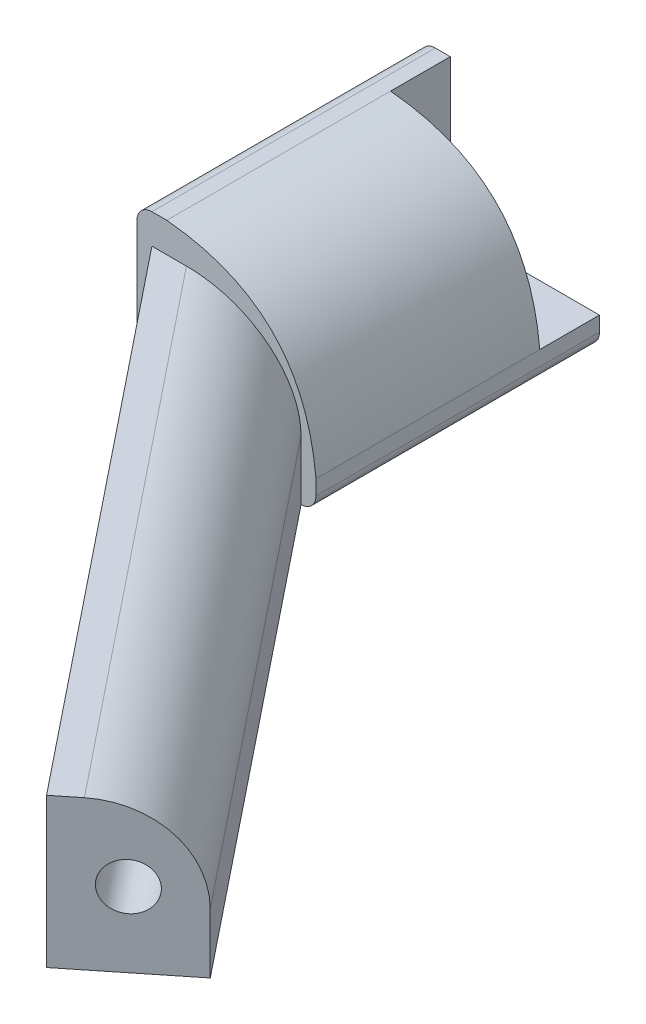
ISO-10303-21;
HEADER;
FILE_DESCRIPTION(('STEP AP214'),'2;1');
FILE_NAME('part.step','',(''),(''),'','','');
FILE_SCHEMA(('AUTOMOTIVE_DESIGN { 1 0 10303 214 1 1 1 1 }'));
ENDSEC;
DATA;
#1=APPLICATION_CONTEXT('core data for automotive mechanical design processes');
#2=APPLICATION_PROTOCOL_DEFINITION('international standard','automotive_design',2000,#1);
#3=PRODUCT_CONTEXT('',#1,'mechanical');
#4=PRODUCT('Part','Part','',(#3));
#5=PRODUCT_RELATED_PRODUCT_CATEGORY('part','',(#4));
#6=PRODUCT_DEFINITION_FORMATION('','',#4);
#7=PRODUCT_DEFINITION_CONTEXT('part definition',#1,'design');
#8=PRODUCT_DEFINITION('design','',#6,#7);
#9=PRODUCT_DEFINITION_SHAPE('','',#8);
#10=(LENGTH_UNIT() NAMED_UNIT(*) SI_UNIT(.MILLI.,.METRE.));
#11=(NAMED_UNIT(*) PLANE_ANGLE_UNIT() SI_UNIT($,.RADIAN.));
#12=(NAMED_UNIT(*) SI_UNIT($,.STERADIAN.) SOLID_ANGLE_UNIT());
#13=UNCERTAINTY_MEASURE_WITH_UNIT(LENGTH_MEASURE(1.E-05),#10,'distance_accuracy_value','');
#14=(GEOMETRIC_REPRESENTATION_CONTEXT(3) GLOBAL_UNCERTAINTY_ASSIGNED_CONTEXT((#13)) GLOBAL_UNIT_ASSIGNED_CONTEXT((#10,
#11,#12)) REPRESENTATION_CONTEXT('',''));
#15=CARTESIAN_POINT('',(0.,0.,0.));
#16=DIRECTION('',(0.,0.,1.));
#17=DIRECTION('',(1.,0.,0.));
#18=AXIS2_PLACEMENT_3D('',#15,#16,#17);
#19=CARTESIAN_POINT('',(8.98515136267974,8.98515136267974,6.35));
#20=DIRECTION('',(0.,0.,1.));
#21=DIRECTION('',(1.,0.,0.));
#22=AXIS2_PLACEMENT_3D('',#19,#20,#21);
#23=PLANE('',#22);
#24=CARTESIAN_POINT('',(5.08,5.08,6.35));
#25=DIRECTION('',(0.,0.,1.));
#26=DIRECTION('',(1.,0.,0.));
#27=AXIS2_PLACEMENT_3D('',#24,#25,#26);
#28=CIRCLE('',#27,1.2);
#29=CARTESIAN_POINT('',(6.28,5.08,6.35));
#30=VERTEX_POINT('',#29);
#31=EDGE_CURVE('E196',#30,#30,#28,.T.);
#32=ORIENTED_EDGE('',*,*,#31,.F.);
#33=EDGE_LOOP('',(#32));
#34=FACE_BOUND('',#33,.T.);
#35=CARTESIAN_POINT('',(5.08,5.08,6.35));
#36=DIRECTION('',(0.,0.,1.));
#37=DIRECTION('',(1.,0.,0.));
#38=AXIS2_PLACEMENT_3D('',#35,#36,#37);
#39=CIRCLE('',#38,3.175);
#40=CARTESIAN_POINT('',(8.255,5.08,6.35));
#41=VERTEX_POINT('',#40);
#42=EDGE_CURVE('E165',#41,#41,#39,.T.);
#43=ORIENTED_EDGE('',*,*,#42,.T.);
#44=EDGE_LOOP('',(#43));
#45=FACE_BOUND('',#44,.T.);
#46=ADVANCED_FACE('F39',(#34,#45),#23,.T.);
#47=CARTESIAN_POINT('',(8.98515136267031,8.98515136267032,0.));
#48=DIRECTION('',(0.,0.,1.));
#49=DIRECTION('',(1.,0.,0.));
#50=AXIS2_PLACEMENT_3D('',#47,#48,#49);
#51=PLANE('',#50);
#52=DIRECTION('',(0.,-1.,0.));
#53=VECTOR('',#52,1.);
#54=CARTESIAN_POINT('',(0.,0.,0.));
#55=LINE('',#54,#53);
#56=CARTESIAN_POINT('',(0.,12.7,0.));
#57=VERTEX_POINT('',#56);
#58=CARTESIAN_POINT('',(0.,0.,0.));
#59=VERTEX_POINT('',#58);
#60=EDGE_CURVE('E259',#57,#59,#55,.T.);
#61=ORIENTED_EDGE('',*,*,#60,.F.);
#62=CARTESIAN_POINT('',(12.7,0.,0.));
#63=CARTESIAN_POINT('',(11.6203027253406,11.6203027253406,0.));
#64=CARTESIAN_POINT('',(0.,12.7,0.));
#65=B_SPLINE_CURVE_WITH_KNOTS('',2,(#62,#63,#64),.UNSPECIFIED.,.F.,.F.,(3,3),(0.,1.),.UNSPECIFIED.);
#66=CARTESIAN_POINT('',(12.7,0.,0.));
#67=VERTEX_POINT('',#66);
#68=EDGE_CURVE('E411',#67,#57,#65,.T.);
#69=ORIENTED_EDGE('',*,*,#68,.F.);
#70=DIRECTION('',(1.,0.,0.));
#71=VECTOR('',#70,1.);
#72=CARTESIAN_POINT('',(0.,0.,0.));
#73=LINE('',#72,#71);
#74=EDGE_CURVE('E263',#59,#67,#73,.T.);
#75=ORIENTED_EDGE('',*,*,#74,.F.);
#76=EDGE_LOOP('',(#61,#69,#75));
#77=FACE_BOUND('',#76,.T.);
#78=CARTESIAN_POINT('',(5.08,5.08,0.));
#79=DIRECTION('',(0.,0.,1.));
#80=DIRECTION('',(1.,0.,0.));
#81=AXIS2_PLACEMENT_3D('',#78,#79,#80);
#82=CIRCLE('',#81,3.1115);
#83=CARTESIAN_POINT('',(1.9685,5.08,0.));
#84=VERTEX_POINT('',#83);
#85=EDGE_CURVE('E254',#84,#84,#82,.T.);
#86=ORIENTED_EDGE('',*,*,#85,.T.);
#87=EDGE_LOOP('',(#86));
#88=FACE_BOUND('',#87,.T.);
#89=ADVANCED_FACE('F277',(#77,#88),#51,.F.);
#90=CARTESIAN_POINT('',(12.7,0.,3.81));
#91=CARTESIAN_POINT('',(11.6203027253406,11.6203027253406,3.81));
#92=CARTESIAN_POINT('',(0.,12.7,3.81));
#93=B_SPLINE_CURVE_WITH_KNOTS('',2,(#90,#91,#92),.UNSPECIFIED.,.F.,.F.,(3,3),(0.,1.),.UNSPECIFIED.);
#94=DIRECTION('',(0.,0.,-1.));
#95=VECTOR('',#94,1.);
#96=SURFACE_OF_LINEAR_EXTRUSION('',#93,#95);
#97=ORIENTED_EDGE('',*,*,#68,.T.);
#98=DIRECTION('',(0.,0.,-1.));
#99=VECTOR('',#98,1.);
#100=CARTESIAN_POINT('',(0.,12.7,3.81));
#101=LINE('',#100,#99);
#102=CARTESIAN_POINT('',(0.,12.7,19.05));
#103=VERTEX_POINT('',#102);
#104=EDGE_CURVE('E408',#103,#57,#101,.T.);
#105=ORIENTED_EDGE('',*,*,#104,.F.);
#106=CARTESIAN_POINT('',(12.7,0.,19.05));
#107=CARTESIAN_POINT('',(11.6203027253595,11.6203027253595,19.05));
#108=CARTESIAN_POINT('',(0.,12.7,19.05));
#109=B_SPLINE_CURVE_WITH_KNOTS('',2,(#106,#107,#108),.UNSPECIFIED.,.F.,.F.,(3,3),(0.,1.),.UNSPECIFIED.);
#110=CARTESIAN_POINT('',(12.7,0.,19.05));
#111=VERTEX_POINT('',#110);
#112=EDGE_CURVE('E173',#111,#103,#109,.T.);
#113=ORIENTED_EDGE('',*,*,#112,.F.);
#114=DIRECTION('',(0.,0.,-1.));
#115=VECTOR('',#114,1.);
#116=CARTESIAN_POINT('',(12.7,0.,3.81));
#117=LINE('',#116,#115);
#118=EDGE_CURVE('E392',#111,#67,#117,.T.);
#119=ORIENTED_EDGE('',*,*,#118,.T.);
#120=EDGE_LOOP('',(#97,#105,#113,#119));
#121=FACE_BOUND('',#120,.T.);
#122=ADVANCED_FACE('F273',(#121),#96,.F.);
#123=CARTESIAN_POINT('',(5.08,5.08,3.81));
#124=DIRECTION('',(0.,0.,-1.));
#125=DIRECTION('',(-1.,0.,0.));
#126=AXIS2_PLACEMENT_3D('',#123,#124,#125);
#127=CYLINDRICAL_SURFACE('',#126,3.1115);
#128=CARTESIAN_POINT('',(5.08,5.08,3.81));
#129=DIRECTION('',(0.,0.,1.));
#130=DIRECTION('',(1.,0.,0.));
#131=AXIS2_PLACEMENT_3D('',#128,#129,#130);
#132=CIRCLE('',#131,3.1115);
#133=CARTESIAN_POINT('',(1.9685,5.08,3.81));
#134=VERTEX_POINT('',#133);
#135=EDGE_CURVE('E199',#134,#134,#132,.T.);
#136=CARTESIAN_POINT('',(1.9685,5.08,3.81));
#137=CARTESIAN_POINT('',(1.9685,5.08,3.7703125));
#138=CARTESIAN_POINT('',(1.9685,5.08,3.730625));
#139=CARTESIAN_POINT('',(1.9685,5.08,3.65125));
#140=CARTESIAN_POINT('',(1.9685,5.08,3.6115625));
#141=CARTESIAN_POINT('',(1.9685,5.08,3.5321875));
#142=CARTESIAN_POINT('',(1.9685,5.08,3.4925));
#143=CARTESIAN_POINT('',(1.9685,5.08,3.413125));
#144=CARTESIAN_POINT('',(1.9685,5.08,3.3734375));
#145=CARTESIAN_POINT('',(1.9685,5.08,3.2940625));
#146=CARTESIAN_POINT('',(1.9685,5.08,3.254375));
#147=CARTESIAN_POINT('',(1.9685,5.08,3.175));
#148=CARTESIAN_POINT('',(1.9685,5.08,3.1353125));
#149=CARTESIAN_POINT('',(1.9685,5.08,3.0559375));
#150=CARTESIAN_POINT('',(1.9685,5.08,3.01625));
#151=CARTESIAN_POINT('',(1.9685,5.08,2.936875));
#152=CARTESIAN_POINT('',(1.9685,5.08,2.8971875));
#153=CARTESIAN_POINT('',(1.9685,5.08,2.8178125));
#154=CARTESIAN_POINT('',(1.9685,5.08,2.778125));
#155=CARTESIAN_POINT('',(1.9685,5.08,2.69875));
#156=CARTESIAN_POINT('',(1.9685,5.08,2.6590625));
#157=CARTESIAN_POINT('',(1.9685,5.08,2.5796875));
#158=CARTESIAN_POINT('',(1.9685,5.08,2.54));
#159=CARTESIAN_POINT('',(1.9685,5.08,2.460625));
#160=CARTESIAN_POINT('',(1.9685,5.08,2.4209375));
#161=CARTESIAN_POINT('',(1.9685,5.08,2.3415625));
#162=CARTESIAN_POINT('',(1.9685,5.08,2.301875));
#163=CARTESIAN_POINT('',(1.9685,5.08,2.2225));
#164=CARTESIAN_POINT('',(1.9685,5.08,2.1828125));
#165=CARTESIAN_POINT('',(1.9685,5.08,2.1034375));
#166=CARTESIAN_POINT('',(1.9685,5.08,2.06375));
#167=CARTESIAN_POINT('',(1.9685,5.08,1.984375));
#168=CARTESIAN_POINT('',(1.9685,5.08,1.9446875));
#169=CARTESIAN_POINT('',(1.9685,5.08,1.8653125));
#170=CARTESIAN_POINT('',(1.9685,5.08,1.825625));
#171=CARTESIAN_POINT('',(1.9685,5.08,1.74625));
#172=CARTESIAN_POINT('',(1.9685,5.08,1.7065625));
#173=CARTESIAN_POINT('',(1.9685,5.08,1.6271875));
#174=CARTESIAN_POINT('',(1.9685,5.08,1.5875));
#175=CARTESIAN_POINT('',(1.9685,5.08,1.508125));
#176=CARTESIAN_POINT('',(1.9685,5.08,1.4684375));
#177=CARTESIAN_POINT('',(1.9685,5.08,1.3890625));
#178=CARTESIAN_POINT('',(1.9685,5.08,1.349375));
#179=CARTESIAN_POINT('',(1.9685,5.08,1.27));
#180=CARTESIAN_POINT('',(1.9685,5.08,1.2303125));
#181=CARTESIAN_POINT('',(1.9685,5.08,1.1509375));
#182=CARTESIAN_POINT('',(1.9685,5.08,1.11125));
#183=CARTESIAN_POINT('',(1.9685,5.08,1.031875));
#184=CARTESIAN_POINT('',(1.9685,5.08,0.9921875));
#185=CARTESIAN_POINT('',(1.9685,5.08,0.9128125));
#186=CARTESIAN_POINT('',(1.9685,5.08,0.873125));
#187=CARTESIAN_POINT('',(1.9685,5.08,0.79375));
#188=CARTESIAN_POINT('',(1.9685,5.08,0.7540625));
#189=CARTESIAN_POINT('',(1.9685,5.08,0.6746875));
#190=CARTESIAN_POINT('',(1.9685,5.08,0.635));
#191=CARTESIAN_POINT('',(1.9685,5.08,0.555625));
#192=CARTESIAN_POINT('',(1.9685,5.08,0.5159375));
#193=CARTESIAN_POINT('',(1.9685,5.08,0.4365625));
#194=CARTESIAN_POINT('',(1.9685,5.08,0.396875));
#195=CARTESIAN_POINT('',(1.9685,5.08,0.3175));
#196=CARTESIAN_POINT('',(1.9685,5.08,0.2778125));
#197=CARTESIAN_POINT('',(1.9685,5.08,0.1984375));
#198=CARTESIAN_POINT('',(1.9685,5.08,0.15875));
#199=CARTESIAN_POINT('',(1.9685,5.08,0.0793749999999999));
#200=CARTESIAN_POINT('',(1.9685,5.08,0.0396874999999999));
#201=CARTESIAN_POINT('',(1.9685,5.08,0.));
#202=B_SPLINE_CURVE_WITH_KNOTS('',3,(#136,#137,#138,#139,#140,#141,#142,#143,#144,#145,#146,
#147,#148,#149,#150,#151,#152,#153,#154,#155,#156,#157,#158,#159,#160,#161,#162,#163,#164,#165,
#166,#167,#168,#169,#170,#171,#172,#173,#174,#175,#176,#177,#178,#179,#180,#181,#182,#183,#184,
#185,#186,#187,#188,#189,#190,#191,#192,#193,#194,#195,#196,#197,#198,#199,#200,#201),
.UNSPECIFIED.,.F.,.F.,(4,2,2,2,2,2,2,2,2,2,2,2,2,2,2,2,2,2,2,2,2,2,2,2,2,2,2,2,2,2,2,2,4),(0.,
0.1190625,0.238125,0.3571875,0.47625,0.5953125,0.714375,0.8334375,0.9525,1.0715625,1.190625,
1.3096875,1.42875,1.5478125,1.666875,1.7859375,1.905,2.0240625,2.143125,2.2621875,2.38125,
2.5003125,2.619375,2.7384375,2.8575,2.9765625,3.095625,3.2146875,3.33375,3.4528125,3.571875,
3.6909375,3.81),.UNSPECIFIED.);
#203=EDGE_CURVE('BSEAM276',#134,#84,#202,.T.);
#204=ORIENTED_EDGE('',*,*,#135,.T.);
#205=ORIENTED_EDGE('',*,*,#85,.F.);
#206=ORIENTED_EDGE('',*,*,#203,.T.);
#207=ORIENTED_EDGE('',*,*,#203,.F.);
#208=EDGE_LOOP('',(#204,#206,#205,#207));
#209=FACE_BOUND('',#208,.T.);
#210=ADVANCED_FACE('F276',(#209),#127,.F.);
#211=CARTESIAN_POINT('',(0.,0.,3.81));
#212=DIRECTION('',(0.,1.,0.));
#213=DIRECTION('',(0.,0.,1.));
#214=AXIS2_PLACEMENT_3D('',#211,#212,#213);
#215=PLANE('',#214);
#216=ORIENTED_EDGE('',*,*,#74,.T.);
#217=DIRECTION('',(0.,0.,-1.));
#218=VECTOR('',#217,1.);
#219=CARTESIAN_POINT('',(12.7,0.,3.81));
#220=LINE('',#219,#218);
#221=CARTESIAN_POINT('',(12.7,0.,-5.08));
#222=VERTEX_POINT('',#221);
#223=EDGE_CURVE('E241',#67,#222,#220,.T.);
#224=ORIENTED_EDGE('',*,*,#223,.T.);
#225=DIRECTION('',(1.,0.,0.));
#226=VECTOR('',#225,1.);
#227=CARTESIAN_POINT('',(0.,0.,-5.08));
#228=LINE('',#227,#226);
#229=CARTESIAN_POINT('',(0.,0.,-5.08));
#230=VERTEX_POINT('',#229);
#231=EDGE_CURVE('E220',#230,#222,#228,.T.);
#232=ORIENTED_EDGE('',*,*,#231,.F.);
#233=DIRECTION('',(0.,0.,-1.));
#234=VECTOR('',#233,1.);
#235=CARTESIAN_POINT('',(0.,0.,3.81));
#236=LINE('',#235,#234);
#237=EDGE_CURVE('E234',#59,#230,#236,.T.);
#238=ORIENTED_EDGE('',*,*,#237,.F.);
#239=EDGE_LOOP('',(#216,#224,#232,#238));
#240=FACE_BOUND('',#239,.T.);
#241=ADVANCED_FACE('F284',(#240),#215,.T.);
#242=CARTESIAN_POINT('',(0.,12.7,3.81));
#243=DIRECTION('',(1.,0.,0.));
#244=DIRECTION('',(0.,0.,-1.));
#245=AXIS2_PLACEMENT_3D('',#242,#243,#244);
#246=PLANE('',#245);
#247=ORIENTED_EDGE('',*,*,#60,.T.);
#248=ORIENTED_EDGE('',*,*,#237,.T.);
#249=DIRECTION('',(0.,-1.,0.));
#250=VECTOR('',#249,1.);
#251=CARTESIAN_POINT('',(0.,12.7,-5.08));
#252=LINE('',#251,#250);
#253=CARTESIAN_POINT('',(0.,12.7,-5.08));
#254=VERTEX_POINT('',#253);
#255=EDGE_CURVE('E223',#254,#230,#252,.T.);
#256=ORIENTED_EDGE('',*,*,#255,.F.);
#257=DIRECTION('',(0.,0.,-1.));
#258=VECTOR('',#257,1.);
#259=CARTESIAN_POINT('',(0.,12.7,3.81));
#260=LINE('',#259,#258);
#261=EDGE_CURVE('E231',#57,#254,#260,.T.);
#262=ORIENTED_EDGE('',*,*,#261,.F.);
#263=EDGE_LOOP('',(#247,#248,#256,#262));
#264=FACE_BOUND('',#263,.T.);
#265=ADVANCED_FACE('F290',(#264),#246,.T.);
#266=CARTESIAN_POINT('',(-1.27,11.43,3.81));
#267=DIRECTION('',(0.,0.,-1.));
#268=DIRECTION('',(-1.,0.,0.));
#269=AXIS2_PLACEMENT_3D('',#266,#267,#268);
#270=CYLINDRICAL_SURFACE('',#269,1.27);
#271=DIRECTION('',(0.,0.,-1.));
#272=VECTOR('',#271,1.);
#273=CARTESIAN_POINT('',(-1.26999999999999,12.7,3.81));
#274=LINE('',#273,#272);
#275=CARTESIAN_POINT('',(-1.27,12.7,19.05));
#276=VERTEX_POINT('',#275);
#277=CARTESIAN_POINT('',(-1.26999999999999,12.7,-5.08));
#278=VERTEX_POINT('',#277);
#279=EDGE_CURVE('E229',#276,#278,#274,.T.);
#280=ORIENTED_EDGE('',*,*,#279,.T.);
#281=CARTESIAN_POINT('',(-1.27,11.43,-5.08));
#282=DIRECTION('',(0.,0.,1.));
#283=DIRECTION('',(1.,0.,0.));
#284=AXIS2_PLACEMENT_3D('',#281,#282,#283);
#285=CIRCLE('',#284,1.27);
#286=CARTESIAN_POINT('',(-2.54,11.43,-5.08));
#287=VERTEX_POINT('',#286);
#288=EDGE_CURVE('E202',#278,#287,#285,.T.);
#289=ORIENTED_EDGE('',*,*,#288,.T.);
#290=DIRECTION('',(0.,0.,-1.));
#291=VECTOR('',#290,1.);
#292=CARTESIAN_POINT('',(-2.54,11.43,3.81));
#293=LINE('',#292,#291);
#294=CARTESIAN_POINT('',(-2.54,11.43,19.05));
#295=VERTEX_POINT('',#294);
#296=EDGE_CURVE('E239',#295,#287,#293,.T.);
#297=ORIENTED_EDGE('',*,*,#296,.F.);
#298=CARTESIAN_POINT('',(-1.27,11.43,19.05));
#299=DIRECTION('',(0.,0.,1.));
#300=DIRECTION('',(-1.,0.,0.));
#301=AXIS2_PLACEMENT_3D('',#298,#299,#300);
#302=CIRCLE('',#301,1.27);
#303=EDGE_CURVE('E183',#276,#295,#302,.T.);
#304=ORIENTED_EDGE('',*,*,#303,.F.);
#305=EDGE_LOOP('',(#280,#289,#297,#304));
#306=FACE_BOUND('',#305,.T.);
#307=ADVANCED_FACE('F286',(#306),#270,.T.);
#308=CARTESIAN_POINT('',(-2.54,11.43,3.81));
#309=DIRECTION('',(1.,0.,0.));
#310=DIRECTION('',(0.,1.,0.));
#311=AXIS2_PLACEMENT_3D('',#308,#309,#310);
#312=PLANE('',#311);
#313=ORIENTED_EDGE('',*,*,#296,.T.);
#314=DIRECTION('',(0.,-1.,0.));
#315=VECTOR('',#314,1.);
#316=CARTESIAN_POINT('',(-2.54,11.43,-5.08));
#317=LINE('',#316,#315);
#318=CARTESIAN_POINT('',(-2.54,-1.26999999999999,-5.08));
#319=VERTEX_POINT('',#318);
#320=EDGE_CURVE('E205',#287,#319,#317,.T.);
#321=ORIENTED_EDGE('',*,*,#320,.T.);
#322=DIRECTION('',(0.,0.,-1.));
#323=VECTOR('',#322,1.);
#324=CARTESIAN_POINT('',(-2.54,-1.26999999999999,3.81));
#325=LINE('',#324,#323);
#326=CARTESIAN_POINT('',(-2.54,-1.26999999999999,19.05));
#327=VERTEX_POINT('',#326);
#328=EDGE_CURVE('E251',#327,#319,#325,.T.);
#329=ORIENTED_EDGE('',*,*,#328,.F.);
#330=DIRECTION('',(0.,-1.,0.));
#331=VECTOR('',#330,1.);
#332=CARTESIAN_POINT('',(-2.54,11.43,19.05));
#333=LINE('',#332,#331);
#334=EDGE_CURVE('E186',#295,#327,#333,.T.);
#335=ORIENTED_EDGE('',*,*,#334,.F.);
#336=EDGE_LOOP('',(#313,#321,#329,#335));
#337=FACE_BOUND('',#336,.T.);
#338=ADVANCED_FACE('F289',(#337),#312,.F.);
#339=CARTESIAN_POINT('',(-1.27,-1.27,3.81));
#340=DIRECTION('',(0.,0.,-1.));
#341=DIRECTION('',(-1.,0.,0.));
#342=AXIS2_PLACEMENT_3D('',#339,#340,#341);
#343=CYLINDRICAL_SURFACE('',#342,1.27);
#344=ORIENTED_EDGE('',*,*,#328,.T.);
#345=CARTESIAN_POINT('',(-1.27,-1.27,-5.08));
#346=DIRECTION('',(0.,0.,-1.));
#347=DIRECTION('',(-1.,0.,0.));
#348=AXIS2_PLACEMENT_3D('',#345,#346,#347);
#349=CIRCLE('',#348,1.27);
#350=CARTESIAN_POINT('',(-1.26999999999999,-2.54,-5.08));
#351=VERTEX_POINT('',#350);
#352=EDGE_CURVE('E208',#351,#319,#349,.T.);
#353=ORIENTED_EDGE('',*,*,#352,.F.);
#354=DIRECTION('',(0.,0.,-1.));
#355=VECTOR('',#354,1.);
#356=CARTESIAN_POINT('',(-1.26999999999999,-2.54,3.81));
#357=LINE('',#356,#355);
#358=CARTESIAN_POINT('',(-1.26999999999999,-2.54,19.05));
#359=VERTEX_POINT('',#358);
#360=EDGE_CURVE('E250',#359,#351,#357,.T.);
#361=ORIENTED_EDGE('',*,*,#360,.F.);
#362=CARTESIAN_POINT('',(-1.27,-1.27,19.05));
#363=DIRECTION('',(0.,0.,1.));
#364=DIRECTION('',(1.,0.,0.));
#365=AXIS2_PLACEMENT_3D('',#362,#363,#364);
#366=CIRCLE('',#365,1.27);
#367=EDGE_CURVE('E161',#327,#359,#366,.T.);
#368=ORIENTED_EDGE('',*,*,#367,.F.);
#369=EDGE_LOOP('',(#344,#353,#361,#368));
#370=FACE_BOUND('',#369,.T.);
#371=ADVANCED_FACE('F294',(#370),#343,.T.);
#372=CARTESIAN_POINT('',(11.43,-2.54,3.81));
#373=DIRECTION('',(0.,-1.,0.));
#374=DIRECTION('',(0.,0.,-1.));
#375=AXIS2_PLACEMENT_3D('',#372,#373,#374);
#376=PLANE('',#375);
#377=ORIENTED_EDGE('',*,*,#360,.T.);
#378=DIRECTION('',(-1.,0.,0.));
#379=VECTOR('',#378,1.);
#380=CARTESIAN_POINT('',(11.43,-2.54,-5.08));
#381=LINE('',#380,#379);
#382=CARTESIAN_POINT('',(11.43,-2.54,-5.08));
#383=VERTEX_POINT('',#382);
#384=EDGE_CURVE('E211',#383,#351,#381,.T.);
#385=ORIENTED_EDGE('',*,*,#384,.F.);
#386=DIRECTION('',(0.,0.,-1.));
#387=VECTOR('',#386,1.);
#388=CARTESIAN_POINT('',(11.43,-2.54,3.81));
#389=LINE('',#388,#387);
#390=CARTESIAN_POINT('',(11.43,-2.54,19.05));
#391=VERTEX_POINT('',#390);
#392=EDGE_CURVE('E248',#391,#383,#389,.T.);
#393=ORIENTED_EDGE('',*,*,#392,.F.);
#394=DIRECTION('',(0.624970196645458,0.,0.780648610646902));
#395=VECTOR('',#394,1.);
#396=CARTESIAN_POINT('',(11.43,-2.54,19.05));
#397=LINE('',#396,#395);
#398=CARTESIAN_POINT('',(42.4640691225712,-2.54,57.8145732121188));
#399=VERTEX_POINT('',#398);
#400=EDGE_CURVE('E155',#391,#399,#397,.T.);
#401=ORIENTED_EDGE('',*,*,#400,.T.);
#402=DIRECTION('',(-0.780648610646902,0.,0.624970196645457));
#403=VECTOR('',#402,1.);
#404=CARTESIAN_POINT('',(42.4640691225712,-2.54,57.8145732121188));
#405=LINE('',#404,#403);
#406=CARTESIAN_POINT('',(34.7245335055985,-2.54,64.0106760815977));
#407=VERTEX_POINT('',#406);
#408=EDGE_CURVE('E387',#399,#407,#405,.T.);
#409=ORIENTED_EDGE('',*,*,#408,.T.);
#410=DIRECTION('',(0.624970196645458,0.,0.780648610646902));
#411=VECTOR('',#410,1.);
#412=CARTESIAN_POINT('',(-1.26999999999999,-2.54,19.05));
#413=LINE('',#412,#411);
#414=EDGE_CURVE('E385',#359,#407,#413,.T.);
#415=ORIENTED_EDGE('',*,*,#414,.F.);
#416=EDGE_LOOP('',(#377,#385,#393,#401,#409,#415));
#417=FACE_BOUND('',#416,.T.);
#418=ADVANCED_FACE('F297',(#417),#376,.T.);
#419=CARTESIAN_POINT('',(11.43,-1.27,3.81));
#420=DIRECTION('',(0.,0.,-1.));
#421=DIRECTION('',(-1.,0.,0.));
#422=AXIS2_PLACEMENT_3D('',#419,#420,#421);
#423=CYLINDRICAL_SURFACE('',#422,1.27);
#424=ORIENTED_EDGE('',*,*,#392,.T.);
#425=CARTESIAN_POINT('',(11.43,-1.27,-5.08));
#426=DIRECTION('',(0.,0.,-1.));
#427=DIRECTION('',(-1.,0.,0.));
#428=AXIS2_PLACEMENT_3D('',#425,#426,#427);
#429=CIRCLE('',#428,1.27);
#430=CARTESIAN_POINT('',(12.7,-1.26999999999999,-5.08));
#431=VERTEX_POINT('',#430);
#432=EDGE_CURVE('E214',#431,#383,#429,.T.);
#433=ORIENTED_EDGE('',*,*,#432,.F.);
#434=DIRECTION('',(0.,0.,-1.));
#435=VECTOR('',#434,1.);
#436=CARTESIAN_POINT('',(12.7,-1.26999999999999,3.81));
#437=LINE('',#436,#435);
#438=CARTESIAN_POINT('',(12.7,-1.27,19.05));
#439=VERTEX_POINT('',#438);
#440=EDGE_CURVE('E243',#439,#431,#437,.T.);
#441=ORIENTED_EDGE('',*,*,#440,.F.);
#442=CARTESIAN_POINT('',(11.43,-1.27,19.05));
#443=DIRECTION('',(0.,0.,1.));
#444=DIRECTION('',(1.,0.,0.));
#445=AXIS2_PLACEMENT_3D('',#442,#443,#444);
#446=CIRCLE('',#445,1.27);
#447=EDGE_CURVE('E189',#391,#439,#446,.T.);
#448=ORIENTED_EDGE('',*,*,#447,.F.);
#449=EDGE_LOOP('',(#424,#433,#441,#448));
#450=FACE_BOUND('',#449,.T.);
#451=ADVANCED_FACE('F300',(#450),#423,.T.);
#452=CARTESIAN_POINT('',(12.7,0.,3.81));
#453=DIRECTION('',(1.,0.,0.));
#454=DIRECTION('',(0.,0.,-1.));
#455=AXIS2_PLACEMENT_3D('',#452,#453,#454);
#456=PLANE('',#455);
#457=ORIENTED_EDGE('',*,*,#440,.T.);
#458=DIRECTION('',(0.,-1.,0.));
#459=VECTOR('',#458,1.);
#460=CARTESIAN_POINT('',(12.7,0.,-5.08));
#461=LINE('',#460,#459);
#462=EDGE_CURVE('E217',#222,#431,#461,.T.);
#463=ORIENTED_EDGE('',*,*,#462,.F.);
#464=ORIENTED_EDGE('',*,*,#223,.F.);
#465=ORIENTED_EDGE('',*,*,#118,.F.);
#466=DIRECTION('',(0.,1.,0.));
#467=VECTOR('',#466,1.);
#468=CARTESIAN_POINT('',(12.7,-1.27,19.05));
#469=LINE('',#468,#467);
#470=EDGE_CURVE('E192',#439,#111,#469,.T.);
#471=ORIENTED_EDGE('',*,*,#470,.F.);
#472=EDGE_LOOP('',(#457,#463,#464,#465,#471));
#473=FACE_BOUND('',#472,.T.);
#474=ADVANCED_FACE('F304',(#473),#456,.T.);
#475=CARTESIAN_POINT('',(0.,12.7,3.81));
#476=DIRECTION('',(0.,-1.,0.));
#477=DIRECTION('',(0.,0.,-1.));
#478=AXIS2_PLACEMENT_3D('',#475,#476,#477);
#479=PLANE('',#478);
#480=ORIENTED_EDGE('',*,*,#104,.T.);
#481=ORIENTED_EDGE('',*,*,#261,.T.);
#482=DIRECTION('',(-1.,0.,0.));
#483=VECTOR('',#482,1.);
#484=CARTESIAN_POINT('',(0.,12.7,-5.08));
#485=LINE('',#484,#483);
#486=EDGE_CURVE('E226',#254,#278,#485,.T.);
#487=ORIENTED_EDGE('',*,*,#486,.T.);
#488=ORIENTED_EDGE('',*,*,#279,.F.);
#489=DIRECTION('',(-1.,0.,0.));
#490=VECTOR('',#489,1.);
#491=CARTESIAN_POINT('',(-1.27,12.7,19.05));
#492=LINE('',#491,#490);
#493=EDGE_CURVE('E177',#103,#276,#492,.T.);
#494=ORIENTED_EDGE('',*,*,#493,.F.);
#495=EDGE_LOOP('',(#480,#481,#487,#488,#494));
#496=FACE_BOUND('',#495,.T.);
#497=ADVANCED_FACE('F308',(#496),#479,.F.);
#498=CARTESIAN_POINT('',(-1.27,11.43,-5.08));
#499=DIRECTION('',(0.,0.,1.));
#500=DIRECTION('',(1.,0.,0.));
#501=AXIS2_PLACEMENT_3D('',#498,#499,#500);
#502=PLANE('',#501);
#503=ORIENTED_EDGE('',*,*,#288,.F.);
#504=ORIENTED_EDGE('',*,*,#486,.F.);
#505=ORIENTED_EDGE('',*,*,#255,.T.);
#506=ORIENTED_EDGE('',*,*,#231,.T.);
#507=ORIENTED_EDGE('',*,*,#462,.T.);
#508=ORIENTED_EDGE('',*,*,#432,.T.);
#509=ORIENTED_EDGE('',*,*,#384,.T.);
#510=ORIENTED_EDGE('',*,*,#352,.T.);
#511=ORIENTED_EDGE('',*,*,#320,.F.);
#512=EDGE_LOOP('',(#503,#504,#505,#506,#507,#508,#509,#510,#511));
#513=FACE_BOUND('',#512,.T.);
#514=ADVANCED_FACE('F318',(#513),#502,.F.);
#515=CARTESIAN_POINT('',(8.98515136267974,8.98515136267974,3.81));
#516=DIRECTION('',(0.,0.,1.));
#517=DIRECTION('',(1.,0.,0.));
#518=AXIS2_PLACEMENT_3D('',#515,#516,#517);
#519=PLANE('',#518);
#520=CARTESIAN_POINT('',(5.08,5.08,3.81));
#521=DIRECTION('',(0.,0.,1.));
#522=DIRECTION('',(1.,0.,0.));
#523=AXIS2_PLACEMENT_3D('',#520,#521,#522);
#524=CIRCLE('',#523,1.2);
#525=CARTESIAN_POINT('',(6.28,5.08,3.81));
#526=VERTEX_POINT('',#525);
#527=EDGE_CURVE('E195',#526,#526,#524,.T.);
#528=ORIENTED_EDGE('',*,*,#527,.T.);
#529=EDGE_LOOP('',(#528));
#530=FACE_BOUND('',#529,.T.);
#531=ORIENTED_EDGE('',*,*,#135,.F.);
#532=EDGE_LOOP('',(#531));
#533=FACE_BOUND('',#532,.T.);
#534=ADVANCED_FACE('F322',(#530,#533),#519,.F.);
#535=CARTESIAN_POINT('',(5.08,5.08,6.35));
#536=DIRECTION('',(0.,0.,-1.));
#537=DIRECTION('',(-1.,0.,0.));
#538=AXIS2_PLACEMENT_3D('',#535,#536,#537);
#539=CYLINDRICAL_SURFACE('',#538,1.2);
#540=ORIENTED_EDGE('',*,*,#31,.T.);
#541=EDGE_LOOP('',(#540));
#542=FACE_BOUND('',#541,.T.);
#543=ORIENTED_EDGE('',*,*,#527,.F.);
#544=EDGE_LOOP('',(#543));
#545=FACE_BOUND('',#544,.T.);
#546=ADVANCED_FACE('F326',(#542,#545),#539,.F.);
#547=CARTESIAN_POINT('',(8.98515136267974,8.98515136267974,19.05));
#548=DIRECTION('',(0.,0.,1.));
#549=DIRECTION('',(1.,0.,0.));
#550=AXIS2_PLACEMENT_3D('',#547,#548,#549);
#551=PLANE('',#550);
#552=DIRECTION('',(0.,-1.,0.));
#553=VECTOR('',#552,1.);
#554=CARTESIAN_POINT('',(-1.26999999999999,10.16,19.05));
#555=LINE('',#554,#553);
#556=CARTESIAN_POINT('',(-1.26999999999999,10.16,19.05));
#557=VERTEX_POINT('',#556);
#558=EDGE_CURVE('E151',#557,#359,#555,.T.);
#559=ORIENTED_EDGE('',*,*,#558,.F.);
#560=DIRECTION('',(-1.,0.,0.));
#561=VECTOR('',#560,1.);
#562=CARTESIAN_POINT('',(11.43,10.16,19.05));
#563=LINE('',#562,#561);
#564=CARTESIAN_POINT('',(1.66888610563782,10.16,19.05));
#565=VERTEX_POINT('',#564);
#566=EDGE_CURVE('E136',#565,#557,#563,.T.);
#567=ORIENTED_EDGE('',*,*,#566,.F.);
#568=CARTESIAN_POINT('',(1.66888610563782,2.54,19.05));
#569=DIRECTION('',(0.,0.,1.));
#570=DIRECTION('',(1.,0.,0.));
#571=AXIS2_PLACEMENT_3D('',#568,#569,#570);
#572=ELLIPSE('',#571,9.76111389436218,7.62);
#573=CARTESIAN_POINT('',(11.43,2.54,19.05));
#574=VERTEX_POINT('',#573);
#575=EDGE_CURVE('E11',#565,#574,#572,.F.);
#576=ORIENTED_EDGE('',*,*,#575,.T.);
#577=DIRECTION('',(0.,-1.,0.));
#578=VECTOR('',#577,1.);
#579=CARTESIAN_POINT('',(11.43,10.16,19.05));
#580=LINE('',#579,#578);
#581=EDGE_CURVE('E145',#574,#391,#580,.T.);
#582=ORIENTED_EDGE('',*,*,#581,.T.);
#583=ORIENTED_EDGE('',*,*,#447,.T.);
#584=ORIENTED_EDGE('',*,*,#470,.T.);
#585=ORIENTED_EDGE('',*,*,#112,.T.);
#586=ORIENTED_EDGE('',*,*,#493,.T.);
#587=ORIENTED_EDGE('',*,*,#303,.T.);
#588=ORIENTED_EDGE('',*,*,#334,.T.);
#589=ORIENTED_EDGE('',*,*,#367,.T.);
#590=EDGE_LOOP('',(#559,#567,#576,#582,#583,#584,#585,#586,#587,#588,#589));
#591=FACE_BOUND('',#590,.T.);
#592=ADVANCED_FACE('F158',(#591),#551,.T.);
#593=CARTESIAN_POINT('',(5.08,5.08,19.05));
#594=DIRECTION('',(0.,0.,-1.));
#595=DIRECTION('',(-1.,0.,0.));
#596=AXIS2_PLACEMENT_3D('',#593,#594,#595);
#597=CYLINDRICAL_SURFACE('',#596,3.175);
#598=CARTESIAN_POINT('',(5.08,5.08,19.05));
#599=DIRECTION('',(0.,0.,1.));
#600=DIRECTION('',(1.,0.,0.));
#601=AXIS2_PLACEMENT_3D('',#598,#599,#600);
#602=CIRCLE('',#601,3.175);
#603=CARTESIAN_POINT('',(8.255,5.08,19.05));
#604=VERTEX_POINT('',#603);
#605=EDGE_CURVE('E162',#604,#604,#602,.T.);
#606=ORIENTED_EDGE('',*,*,#605,.T.);
#607=EDGE_LOOP('',(#606));
#608=FACE_BOUND('',#607,.T.);
#609=ORIENTED_EDGE('',*,*,#42,.F.);
#610=EDGE_LOOP('',(#609));
#611=FACE_BOUND('',#610,.T.);
#612=ADVANCED_FACE('F336',(#608,#611),#597,.F.);
#613=CARTESIAN_POINT('',(0.,10.16,0.));
#614=DIRECTION('',(0.,1.,0.));
#615=DIRECTION('',(0.,0.,1.));
#616=AXIS2_PLACEMENT_3D('',#613,#614,#615);
#617=PLANE('',#616);
#618=DIRECTION('',(-0.780648610646902,0.,0.624970196645457));
#619=VECTOR('',#618,1.);
#620=CARTESIAN_POINT('',(42.4640691225712,10.16,57.8145732121188));
#621=LINE('',#620,#619);
#622=CARTESIAN_POINT('',(36.5155267094418,10.16,62.5768461105572));
#623=VERTEX_POINT('',#622);
#624=CARTESIAN_POINT('',(34.7245335055985,10.16,64.0106760815977));
#625=VERTEX_POINT('',#624);
#626=EDGE_CURVE('E154',#623,#625,#621,.T.);
#627=ORIENTED_EDGE('',*,*,#626,.F.);
#628=DIRECTION('',(0.624970196645458,0.,0.780648610646902));
#629=VECTOR('',#628,1.);
#630=CARTESIAN_POINT('',(-8.27711466207226,10.16,6.62647689044834));
#631=LINE('',#630,#629);
#632=EDGE_CURVE('E47',#623,#565,#631,.F.);
#633=ORIENTED_EDGE('',*,*,#632,.T.);
#634=ORIENTED_EDGE('',*,*,#566,.T.);
#635=DIRECTION('',(0.624970196645458,0.,0.780648610646902));
#636=VECTOR('',#635,1.);
#637=CARTESIAN_POINT('',(-1.26999999999999,10.16,19.05));
#638=LINE('',#637,#636);
#639=EDGE_CURVE('E139',#557,#625,#638,.T.);
#640=ORIENTED_EDGE('',*,*,#639,.T.);
#641=EDGE_LOOP('',(#627,#633,#634,#640));
#642=FACE_BOUND('',#641,.T.);
#643=ADVANCED_FACE('F138',(#642),#617,.T.);
#644=CARTESIAN_POINT('',(11.43,10.16,19.05));
#645=DIRECTION('',(0.780648610646901,0.,-0.624970196645458));
#646=DIRECTION('',(-0.624970196645458,0.,-0.780648610646902));
#647=AXIS2_PLACEMENT_3D('',#644,#645,#646);
#648=PLANE('',#647);
#649=ORIENTED_EDGE('',*,*,#581,.F.);
#650=DIRECTION('',(0.624970196645458,0.,0.780648610646902));
#651=VECTOR('',#650,1.);
#652=CARTESIAN_POINT('',(11.43,2.54,19.05));
#653=LINE('',#652,#651);
#654=CARTESIAN_POINT('',(42.4640691225712,2.54,57.8145732121188));
#655=VERTEX_POINT('',#654);
#656=EDGE_CURVE('E144',#574,#655,#653,.T.);
#657=ORIENTED_EDGE('',*,*,#656,.T.);
#658=DIRECTION('',(0.,-1.,0.));
#659=VECTOR('',#658,1.);
#660=CARTESIAN_POINT('',(42.4640691225712,10.16,57.8145732121188));
#661=LINE('',#660,#659);
#662=EDGE_CURVE('E167',#655,#399,#661,.T.);
#663=ORIENTED_EDGE('',*,*,#662,.T.);
#664=ORIENTED_EDGE('',*,*,#400,.F.);
#665=EDGE_LOOP('',(#649,#657,#663,#664));
#666=FACE_BOUND('',#665,.T.);
#667=ADVANCED_FACE('F351',(#666),#648,.T.);
#668=CARTESIAN_POINT('',(42.4640691225712,10.16,57.8145732121188));
#669=DIRECTION('',(0.624970196645457,0.,0.780648610646902));
#670=DIRECTION('',(0.780648610646902,0.,-0.624970196645457));
#671=AXIS2_PLACEMENT_3D('',#668,#669,#670);
#672=PLANE('',#671);
#673=CARTESIAN_POINT('',(38.5943013140848,3.81,60.9126246468583));
#674=DIRECTION('',(0.624970196645458,0.,0.780648610646901));
#675=DIRECTION('',(0.780648610646901,0.,-0.624970196645458));
#676=AXIS2_PLACEMENT_3D('',#673,#674,#675);
#677=CIRCLE('',#676,1.999996);
#678=CARTESIAN_POINT('',(40.1555954127842,3.81,59.6626867534482));
#679=VERTEX_POINT('',#678);
#680=EDGE_CURVE('E376',#679,#679,#677,.T.);
#681=ORIENTED_EDGE('',*,*,#680,.F.);
#682=EDGE_LOOP('',(#681));
#683=FACE_BOUND('',#682,.T.);
#684=ORIENTED_EDGE('',*,*,#662,.F.);
#685=CARTESIAN_POINT('',(36.5155267094418,2.54,62.5768461105572));
#686=DIRECTION('',(0.624970196645457,0.,0.780648610646902));
#687=DIRECTION('',(0.780648610646902,0.,-0.624970196645457));
#688=AXIS2_PLACEMENT_3D('',#685,#686,#687);
#689=CIRCLE('',#688,7.62);
#690=EDGE_CURVE('E61',#655,#623,#689,.T.);
#691=ORIENTED_EDGE('',*,*,#690,.T.);
#692=ORIENTED_EDGE('',*,*,#626,.T.);
#693=DIRECTION('',(0.,-1.,0.));
#694=VECTOR('',#693,1.);
#695=CARTESIAN_POINT('',(34.7245335055985,10.16,64.0106760815977));
#696=LINE('',#695,#694);
#697=EDGE_CURVE('E153',#625,#407,#696,.T.);
#698=ORIENTED_EDGE('',*,*,#697,.T.);
#699=ORIENTED_EDGE('',*,*,#408,.F.);
#700=EDGE_LOOP('',(#684,#691,#692,#698,#699));
#701=FACE_BOUND('',#700,.T.);
#702=ADVANCED_FACE('F347',(#683,#701),#672,.T.);
#703=CARTESIAN_POINT('',(-1.26999999999999,10.16,19.05));
#704=DIRECTION('',(0.780648610646902,0.,-0.624970196645458));
#705=DIRECTION('',(-0.624970196645458,0.,-0.780648610646902));
#706=AXIS2_PLACEMENT_3D('',#703,#704,#705);
#707=PLANE('',#706);
#708=CARTESIAN_POINT('',(5.08,5.08,26.9817681134481));
#709=DIRECTION('',(0.780648610646902,0.,-0.624970196645458));
#710=DIRECTION('',(-0.624970196645458,0.,-0.780648610646902));
#711=AXIS2_PLACEMENT_3D('',#708,#709,#710);
#712=ELLIPSE('',#711,4.9786374081533,3.1115);
#713=CARTESIAN_POINT('',(1.9685,5.08,23.0952017378585));
#714=VERTEX_POINT('',#713);
#715=EDGE_CURVE('E379',#714,#714,#712,.F.);
#716=ORIENTED_EDGE('',*,*,#715,.F.);
#717=EDGE_LOOP('',(#716));
#718=FACE_BOUND('',#717,.T.);
#719=ORIENTED_EDGE('',*,*,#414,.T.);
#720=ORIENTED_EDGE('',*,*,#697,.F.);
#721=ORIENTED_EDGE('',*,*,#639,.F.);
#722=ORIENTED_EDGE('',*,*,#558,.T.);
#723=EDGE_LOOP('',(#719,#720,#721,#722));
#724=FACE_BOUND('',#723,.T.);
#725=ADVANCED_FACE('F150',(#718,#724),#707,.F.);
#726=CARTESIAN_POINT('',(11.43,10.16,19.05));
#727=DIRECTION('',(0.,0.,1.));
#728=DIRECTION('',(1.,0.,0.));
#729=AXIS2_PLACEMENT_3D('',#726,#727,#728);
#730=PLANE('',#729);
#731=CARTESIAN_POINT('',(5.08,5.08,19.05));
#732=DIRECTION('',(0.,0.,1.));
#733=DIRECTION('',(1.,0.,0.));
#734=AXIS2_PLACEMENT_3D('',#731,#732,#733);
#735=CIRCLE('',#734,3.1115);
#736=CARTESIAN_POINT('',(8.1915,5.08,19.05));
#737=VERTEX_POINT('',#736);
#738=EDGE_CURVE('E375',#737,#737,#735,.T.);
#739=ORIENTED_EDGE('',*,*,#738,.T.);
#740=EDGE_LOOP('',(#739));
#741=FACE_BOUND('',#740,.T.);
#742=ORIENTED_EDGE('',*,*,#605,.F.);
#743=EDGE_LOOP('',(#742));
#744=FACE_BOUND('',#743,.T.);
#745=ADVANCED_FACE('F340',(#741,#744),#730,.F.);
#746=CARTESIAN_POINT('',(5.08,5.08,64.0106760815977));
#747=DIRECTION('',(0.,0.,-1.));
#748=DIRECTION('',(-1.,0.,0.));
#749=AXIS2_PLACEMENT_3D('',#746,#747,#748);
#750=CYLINDRICAL_SURFACE('',#749,3.1115);
#751=ORIENTED_EDGE('',*,*,#738,.F.);
#752=EDGE_LOOP('',(#751));
#753=FACE_BOUND('',#752,.T.);
#754=ORIENTED_EDGE('',*,*,#715,.T.);
#755=EDGE_LOOP('',(#754));
#756=FACE_BOUND('',#755,.T.);
#757=ADVANCED_FACE('F343',(#753,#756),#750,.F.);
#758=CARTESIAN_POINT('',(34.2195099563157,3.81,55.4480843957494));
#759=DIRECTION('',(0.624970196645458,0.,0.780648610646901));
#760=DIRECTION('',(0.780648610646901,0.,-0.624970196645458));
#761=AXIS2_PLACEMENT_3D('',#758,#759,#760);
#762=CYLINDRICAL_SURFACE('',#761,1.999996);
#763=CARTESIAN_POINT('',(34.2195099563157,3.81,55.4480843957494));
#764=DIRECTION('',(0.624970196645458,0.,0.780648610646901));
#765=DIRECTION('',(0.780648610646901,0.,-0.624970196645458));
#766=AXIS2_PLACEMENT_3D('',#763,#764,#765);
#767=CIRCLE('',#766,1.999996);
#768=CARTESIAN_POINT('',(35.7808040550151,3.81,54.1981465023393));
#769=VERTEX_POINT('',#768);
#770=EDGE_CURVE('E374',#769,#769,#767,.T.);
#771=ORIENTED_EDGE('',*,*,#770,.F.);
#772=EDGE_LOOP('',(#771));
#773=FACE_BOUND('',#772,.T.);
#774=ORIENTED_EDGE('',*,*,#680,.T.);
#775=EDGE_LOOP('',(#774));
#776=FACE_BOUND('',#775,.T.);
#777=ADVANCED_FACE('F360',(#773,#776),#762,.F.);
#778=CARTESIAN_POINT('',(34.2195099563157,3.81,55.4480843957494));
#779=DIRECTION('',(0.624970196645458,0.,0.780648610646901));
#780=DIRECTION('',(0.780648610646901,0.,-0.624970196645458));
#781=AXIS2_PLACEMENT_3D('',#778,#779,#780);
#782=PLANE('',#781);
#783=ORIENTED_EDGE('',*,*,#770,.T.);
#784=EDGE_LOOP('',(#783));
#785=FACE_BOUND('',#784,.T.);
#786=ADVANCED_FACE('F364',(#785),#782,.T.);
#787=CARTESIAN_POINT('',(5.48145758687061,2.54,23.8122728984384));
#788=DIRECTION('',(0.624970196645458,0.,0.780648610646902));
#789=DIRECTION('',(0.780648610646902,0.,-0.624970196645458));
#790=AXIS2_PLACEMENT_3D('',#787,#788,#789);
#791=CYLINDRICAL_SURFACE('',#790,7.62);
#792=ORIENTED_EDGE('',*,*,#575,.F.);
#793=ORIENTED_EDGE('',*,*,#632,.F.);
#794=ORIENTED_EDGE('',*,*,#690,.F.);
#795=ORIENTED_EDGE('',*,*,#656,.F.);
#796=EDGE_LOOP('',(#792,#793,#794,#795));
#797=FACE_BOUND('',#796,.T.);
#798=ADVANCED_FACE('F41',(#797),#791,.T.);
#799=CLOSED_SHELL('',(#46,#89,#122,#210,#241,#265,#307,#338,#371,#418,#451,#474,#497,#514,#534,
#546,#592,#612,#643,#667,#702,#725,#745,#757,#777,#786,#798));
#800=MANIFOLD_SOLID_BREP('B2',#799);
#801=ADVANCED_BREP_SHAPE_REPRESENTATION('',(#18,#800),#14);
#802=SHAPE_DEFINITION_REPRESENTATION(#9,#801);
ENDSEC;
END-ISO-10303-21;
